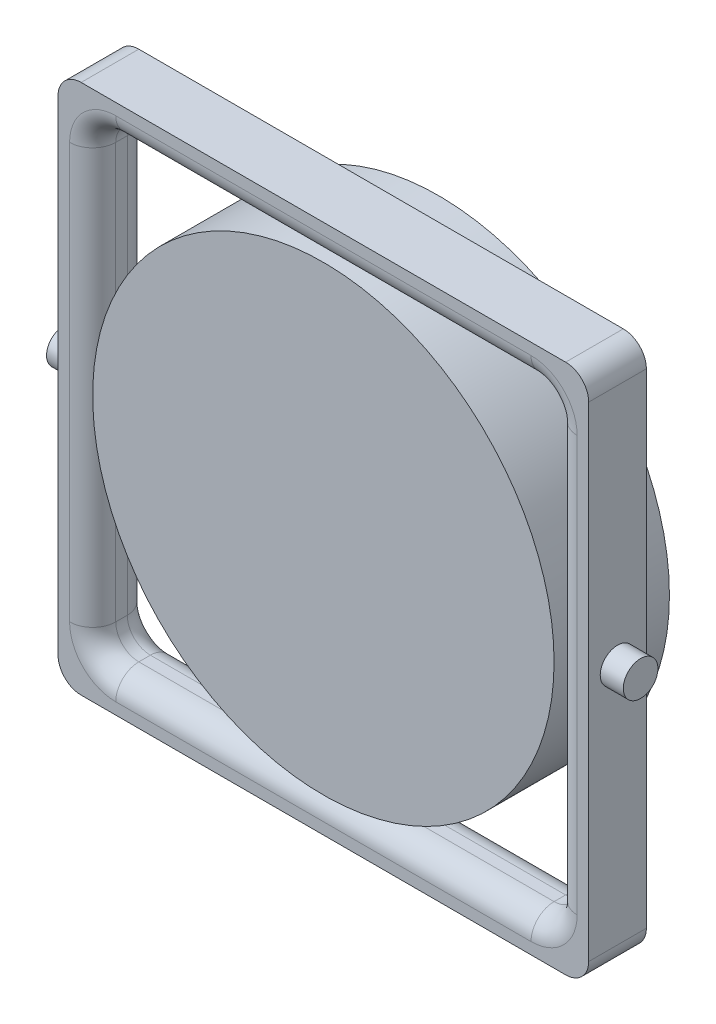
ISO-10303-21;
HEADER;
FILE_DESCRIPTION(('STEP AP214'),'2;1');
FILE_NAME('part.step','',(''),(''),'','','');
FILE_SCHEMA(('AUTOMOTIVE_DESIGN { 1 0 10303 214 1 1 1 1 }'));
ENDSEC;
DATA;
#1=APPLICATION_CONTEXT('core data for automotive mechanical design processes');
#2=APPLICATION_PROTOCOL_DEFINITION('international standard','automotive_design',2000,#1);
#3=PRODUCT_CONTEXT('',#1,'mechanical');
#4=PRODUCT('Part','Part','',(#3));
#5=PRODUCT_RELATED_PRODUCT_CATEGORY('part','',(#4));
#6=PRODUCT_DEFINITION_FORMATION('','',#4);
#7=PRODUCT_DEFINITION_CONTEXT('part definition',#1,'design');
#8=PRODUCT_DEFINITION('design','',#6,#7);
#9=PRODUCT_DEFINITION_SHAPE('','',#8);
#10=(LENGTH_UNIT() NAMED_UNIT(*) SI_UNIT(.MILLI.,.METRE.));
#11=(NAMED_UNIT(*) PLANE_ANGLE_UNIT() SI_UNIT($,.RADIAN.));
#12=(NAMED_UNIT(*) SI_UNIT($,.STERADIAN.) SOLID_ANGLE_UNIT());
#13=UNCERTAINTY_MEASURE_WITH_UNIT(LENGTH_MEASURE(1.E-05),#10,'distance_accuracy_value','');
#14=(GEOMETRIC_REPRESENTATION_CONTEXT(3) GLOBAL_UNCERTAINTY_ASSIGNED_CONTEXT((#13)) GLOBAL_UNIT_ASSIGNED_CONTEXT((#10,
#11,#12)) REPRESENTATION_CONTEXT('',''));
#15=CARTESIAN_POINT('',(0.,0.,0.));
#16=DIRECTION('',(0.,0.,1.));
#17=DIRECTION('',(1.,0.,0.));
#18=AXIS2_PLACEMENT_3D('',#15,#16,#17);
#19=CARTESIAN_POINT('',(0.,0.,-5.));
#20=DIRECTION('',(0.,0.,1.));
#21=DIRECTION('',(1.,0.,0.));
#22=AXIS2_PLACEMENT_3D('',#19,#20,#21);
#23=CYLINDRICAL_SURFACE('',#22,20.);
#24=CARTESIAN_POINT('',(0.,0.,-5.));
#25=DIRECTION('',(0.,0.,1.));
#26=DIRECTION('',(1.,0.,0.));
#27=AXIS2_PLACEMENT_3D('',#24,#25,#26);
#28=CIRCLE('',#27,20.);
#29=CARTESIAN_POINT('',(20.,0.,-5.));
#30=VERTEX_POINT('',#29);
#31=EDGE_CURVE('E11',#30,#30,#28,.T.);
#32=ORIENTED_EDGE('',*,*,#31,.T.);
#33=EDGE_LOOP('',(#32));
#34=FACE_BOUND('',#33,.T.);
#35=CARTESIAN_POINT('',(0.,0.,5.));
#36=DIRECTION('',(0.,0.,1.));
#37=DIRECTION('',(1.,0.,0.));
#38=AXIS2_PLACEMENT_3D('',#35,#36,#37);
#39=CIRCLE('',#38,20.);
#40=CARTESIAN_POINT('',(20.,0.,5.));
#41=VERTEX_POINT('',#40);
#42=EDGE_CURVE('E48',#41,#41,#39,.T.);
#43=ORIENTED_EDGE('',*,*,#42,.F.);
#44=EDGE_LOOP('',(#43));
#45=FACE_BOUND('',#44,.T.);
#46=ADVANCED_FACE('F45',(#34,#45),#23,.T.);
#47=CARTESIAN_POINT('',(0.,0.,-5.));
#48=DIRECTION('',(0.,0.,1.));
#49=DIRECTION('',(1.,0.,0.));
#50=AXIS2_PLACEMENT_3D('',#47,#48,#49);
#51=PLANE('',#50);
#52=ORIENTED_EDGE('',*,*,#31,.F.);
#53=EDGE_LOOP('',(#52));
#54=FACE_BOUND('',#53,.T.);
#55=ADVANCED_FACE('F60',(#54),#51,.F.);
#56=CARTESIAN_POINT('',(0.,0.,5.));
#57=DIRECTION('',(0.,0.,1.));
#58=DIRECTION('',(1.,0.,0.));
#59=AXIS2_PLACEMENT_3D('',#56,#57,#58);
#60=PLANE('',#59);
#61=ORIENTED_EDGE('',*,*,#42,.T.);
#62=EDGE_LOOP('',(#61));
#63=FACE_BOUND('',#62,.T.);
#64=ADVANCED_FACE('F57',(#63),#60,.T.);
#65=CLOSED_SHELL('',(#46,#55,#64));
#66=MANIFOLD_SOLID_BREP('B2',#65);
#67=CARTESIAN_POINT('',(23.,-23.,5.));
#68=DIRECTION('',(-1.,0.,0.));
#69=DIRECTION('',(0.,0.,1.));
#70=AXIS2_PLACEMENT_3D('',#67,#68,#69);
#71=PLANE('',#70);
#72=CARTESIAN_POINT('',(23.,0.,2.5));
#73=DIRECTION('',(-1.,0.,0.));
#74=DIRECTION('',(0.,0.,1.));
#75=AXIS2_PLACEMENT_3D('',#72,#73,#74);
#76=CIRCLE('',#75,1.5);
#77=CARTESIAN_POINT('',(23.,0.,4.));
#78=VERTEX_POINT('',#77);
#79=EDGE_CURVE('E43',#78,#78,#76,.F.);
#80=ORIENTED_EDGE('',*,*,#79,.F.);
#81=EDGE_LOOP('',(#80));
#82=FACE_BOUND('',#81,.T.);
#83=DIRECTION('',(0.,1.,0.));
#84=VECTOR('',#83,1.);
#85=CARTESIAN_POINT('',(23.,-23.,5.));
#86=LINE('',#85,#84);
#87=CARTESIAN_POINT('',(23.,-21.,5.));
#88=VERTEX_POINT('',#87);
#89=CARTESIAN_POINT('',(23.,21.,5.));
#90=VERTEX_POINT('',#89);
#91=EDGE_CURVE('E897',#88,#90,#86,.T.);
#92=ORIENTED_EDGE('',*,*,#91,.F.);
#93=DIRECTION('',(0.,0.,-1.));
#94=VECTOR('',#93,1.);
#95=CARTESIAN_POINT('',(23.,-21.,5.));
#96=LINE('',#95,#94);
#97=CARTESIAN_POINT('',(23.,-21.,0.));
#98=VERTEX_POINT('',#97);
#99=EDGE_CURVE('E271',#88,#98,#96,.T.);
#100=ORIENTED_EDGE('',*,*,#99,.T.);
#101=DIRECTION('',(0.,1.,0.));
#102=VECTOR('',#101,1.);
#103=CARTESIAN_POINT('',(23.,-23.,0.));
#104=LINE('',#103,#102);
#105=CARTESIAN_POINT('',(23.,21.,0.));
#106=VERTEX_POINT('',#105);
#107=EDGE_CURVE('E375',#98,#106,#104,.T.);
#108=ORIENTED_EDGE('',*,*,#107,.T.);
#109=DIRECTION('',(0.,0.,-1.));
#110=VECTOR('',#109,1.);
#111=CARTESIAN_POINT('',(23.,21.,5.));
#112=LINE('',#111,#110);
#113=EDGE_CURVE('E353',#106,#90,#112,.F.);
#114=ORIENTED_EDGE('',*,*,#113,.T.);
#115=EDGE_LOOP('',(#92,#100,#108,#114));
#116=FACE_BOUND('',#115,.T.);
#117=ADVANCED_FACE('F86',(#82,#116),#71,.F.);
#118=CARTESIAN_POINT('',(-23.,23.,5.));
#119=DIRECTION('',(0.,-1.,0.));
#120=DIRECTION('',(0.,0.,-1.));
#121=AXIS2_PLACEMENT_3D('',#118,#119,#120);
#122=PLANE('',#121);
#123=DIRECTION('',(-1.,0.,0.));
#124=VECTOR('',#123,1.);
#125=CARTESIAN_POINT('',(-23.,23.,0.));
#126=LINE('',#125,#124);
#127=CARTESIAN_POINT('',(21.,23.,0.));
#128=VERTEX_POINT('',#127);
#129=CARTESIAN_POINT('',(-21.,23.,0.));
#130=VERTEX_POINT('',#129);
#131=EDGE_CURVE('E885',#128,#130,#126,.T.);
#132=ORIENTED_EDGE('',*,*,#131,.T.);
#133=DIRECTION('',(0.,0.,-1.));
#134=VECTOR('',#133,1.);
#135=CARTESIAN_POINT('',(-21.,23.,5.));
#136=LINE('',#135,#134);
#137=CARTESIAN_POINT('',(-21.,23.,5.));
#138=VERTEX_POINT('',#137);
#139=EDGE_CURVE('E338',#130,#138,#136,.F.);
#140=ORIENTED_EDGE('',*,*,#139,.T.);
#141=DIRECTION('',(-1.,0.,0.));
#142=VECTOR('',#141,1.);
#143=CARTESIAN_POINT('',(-23.,23.,5.));
#144=LINE('',#143,#142);
#145=CARTESIAN_POINT('',(21.,23.,5.));
#146=VERTEX_POINT('',#145);
#147=EDGE_CURVE('E879',#146,#138,#144,.T.);
#148=ORIENTED_EDGE('',*,*,#147,.F.);
#149=DIRECTION('',(0.,0.,-1.));
#150=VECTOR('',#149,1.);
#151=CARTESIAN_POINT('',(21.,23.,5.));
#152=LINE('',#151,#150);
#153=EDGE_CURVE('E335',#146,#128,#152,.T.);
#154=ORIENTED_EDGE('',*,*,#153,.T.);
#155=EDGE_LOOP('',(#132,#140,#148,#154));
#156=FACE_BOUND('',#155,.T.);
#157=ADVANCED_FACE('F524',(#156),#122,.F.);
#158=CARTESIAN_POINT('',(-23.,-23.,5.));
#159=DIRECTION('',(1.,0.,0.));
#160=DIRECTION('',(0.,0.,-1.));
#161=AXIS2_PLACEMENT_3D('',#158,#159,#160);
#162=PLANE('',#161);
#163=CARTESIAN_POINT('',(-23.,0.,2.5));
#164=DIRECTION('',(1.,0.,0.));
#165=DIRECTION('',(0.,0.,-1.));
#166=AXIS2_PLACEMENT_3D('',#163,#164,#165);
#167=CIRCLE('',#166,1.5);
#168=CARTESIAN_POINT('',(-23.,0.,1.));
#169=VERTEX_POINT('',#168);
#170=EDGE_CURVE('E870',#169,#169,#167,.T.);
#171=ORIENTED_EDGE('',*,*,#170,.T.);
#172=EDGE_LOOP('',(#171));
#173=FACE_BOUND('',#172,.T.);
#174=DIRECTION('',(0.,-1.,0.));
#175=VECTOR('',#174,1.);
#176=CARTESIAN_POINT('',(-23.,-23.,5.));
#177=LINE('',#176,#175);
#178=CARTESIAN_POINT('',(-23.,21.,5.));
#179=VERTEX_POINT('',#178);
#180=CARTESIAN_POINT('',(-23.,-21.,5.));
#181=VERTEX_POINT('',#180);
#182=EDGE_CURVE('E873',#179,#181,#177,.T.);
#183=ORIENTED_EDGE('',*,*,#182,.F.);
#184=DIRECTION('',(0.,0.,-1.));
#185=VECTOR('',#184,1.);
#186=CARTESIAN_POINT('',(-23.,21.,5.));
#187=LINE('',#186,#185);
#188=CARTESIAN_POINT('',(-23.,21.,0.));
#189=VERTEX_POINT('',#188);
#190=EDGE_CURVE('E332',#179,#189,#187,.T.);
#191=ORIENTED_EDGE('',*,*,#190,.T.);
#192=DIRECTION('',(0.,-1.,0.));
#193=VECTOR('',#192,1.);
#194=CARTESIAN_POINT('',(-23.,-23.,0.));
#195=LINE('',#194,#193);
#196=CARTESIAN_POINT('',(-23.,-21.,0.));
#197=VERTEX_POINT('',#196);
#198=EDGE_CURVE('E886',#189,#197,#195,.T.);
#199=ORIENTED_EDGE('',*,*,#198,.T.);
#200=DIRECTION('',(0.,0.,-1.));
#201=VECTOR('',#200,1.);
#202=CARTESIAN_POINT('',(-23.,-21.,5.));
#203=LINE('',#202,#201);
#204=EDGE_CURVE('E330',#197,#181,#203,.F.);
#205=ORIENTED_EDGE('',*,*,#204,.T.);
#206=EDGE_LOOP('',(#183,#191,#199,#205));
#207=FACE_BOUND('',#206,.T.);
#208=ADVANCED_FACE('F530',(#173,#207),#162,.F.);
#209=CARTESIAN_POINT('',(-23.,-23.,5.));
#210=DIRECTION('',(0.,1.,0.));
#211=DIRECTION('',(0.,0.,1.));
#212=AXIS2_PLACEMENT_3D('',#209,#210,#211);
#213=PLANE('',#212);
#214=DIRECTION('',(1.,0.,0.));
#215=VECTOR('',#214,1.);
#216=CARTESIAN_POINT('',(-23.,-23.,5.));
#217=LINE('',#216,#215);
#218=CARTESIAN_POINT('',(-21.,-23.,5.));
#219=VERTEX_POINT('',#218);
#220=CARTESIAN_POINT('',(21.,-23.,5.));
#221=VERTEX_POINT('',#220);
#222=EDGE_CURVE('E442',#219,#221,#217,.T.);
#223=ORIENTED_EDGE('',*,*,#222,.F.);
#224=DIRECTION('',(0.,0.,-1.));
#225=VECTOR('',#224,1.);
#226=CARTESIAN_POINT('',(-21.,-23.,5.));
#227=LINE('',#226,#225);
#228=CARTESIAN_POINT('',(-21.,-23.,0.));
#229=VERTEX_POINT('',#228);
#230=EDGE_CURVE('E350',#219,#229,#227,.T.);
#231=ORIENTED_EDGE('',*,*,#230,.T.);
#232=DIRECTION('',(1.,0.,0.));
#233=VECTOR('',#232,1.);
#234=CARTESIAN_POINT('',(-23.,-23.,0.));
#235=LINE('',#234,#233);
#236=CARTESIAN_POINT('',(21.,-23.,0.));
#237=VERTEX_POINT('',#236);
#238=EDGE_CURVE('E891',#229,#237,#235,.T.);
#239=ORIENTED_EDGE('',*,*,#238,.T.);
#240=DIRECTION('',(0.,0.,-1.));
#241=VECTOR('',#240,1.);
#242=CARTESIAN_POINT('',(21.,-23.,5.));
#243=LINE('',#242,#241);
#244=EDGE_CURVE('E348',#237,#221,#243,.F.);
#245=ORIENTED_EDGE('',*,*,#244,.T.);
#246=EDGE_LOOP('',(#223,#231,#239,#245));
#247=FACE_BOUND('',#246,.T.);
#248=ADVANCED_FACE('F815',(#247),#213,.F.);
#249=CARTESIAN_POINT('',(0.,0.,5.));
#250=DIRECTION('',(0.,0.,-1.));
#251=DIRECTION('',(-1.,0.,0.));
#252=AXIS2_PLACEMENT_3D('',#249,#250,#251);
#253=PLANE('',#252);
#254=DIRECTION('',(0.,-1.,0.));
#255=VECTOR('',#254,1.);
#256=CARTESIAN_POINT('',(-22.,0.,5.));
#257=LINE('',#256,#255);
#258=CARTESIAN_POINT('',(-22.,-18.,5.));
#259=VERTEX_POINT('',#258);
#260=CARTESIAN_POINT('',(-22.,18.,5.));
#261=VERTEX_POINT('',#260);
#262=EDGE_CURVE('E270',#259,#261,#257,.F.);
#263=ORIENTED_EDGE('',*,*,#262,.T.);
#264=CARTESIAN_POINT('',(-18.,18.,5.));
#265=DIRECTION('',(0.,0.,-1.));
#266=DIRECTION('',(-1.,0.,0.));
#267=AXIS2_PLACEMENT_3D('',#264,#265,#266);
#268=CIRCLE('',#267,4.);
#269=CARTESIAN_POINT('',(-18.,22.,5.));
#270=VERTEX_POINT('',#269);
#271=EDGE_CURVE('E389',#261,#270,#268,.T.);
#272=ORIENTED_EDGE('',*,*,#271,.T.);
#273=DIRECTION('',(-1.,0.,0.));
#274=VECTOR('',#273,1.);
#275=CARTESIAN_POINT('',(0.,22.,5.));
#276=LINE('',#275,#274);
#277=CARTESIAN_POINT('',(18.,22.,5.));
#278=VERTEX_POINT('',#277);
#279=EDGE_CURVE('E387',#270,#278,#276,.F.);
#280=ORIENTED_EDGE('',*,*,#279,.T.);
#281=CARTESIAN_POINT('',(18.,18.,5.));
#282=DIRECTION('',(0.,0.,-1.));
#283=DIRECTION('',(-1.,0.,0.));
#284=AXIS2_PLACEMENT_3D('',#281,#282,#283);
#285=CIRCLE('',#284,4.);
#286=CARTESIAN_POINT('',(22.,18.,5.));
#287=VERTEX_POINT('',#286);
#288=EDGE_CURVE('E385',#278,#287,#285,.T.);
#289=ORIENTED_EDGE('',*,*,#288,.T.);
#290=DIRECTION('',(0.,1.,0.));
#291=VECTOR('',#290,1.);
#292=CARTESIAN_POINT('',(22.,0.,5.));
#293=LINE('',#292,#291);
#294=CARTESIAN_POINT('',(22.,-18.,5.));
#295=VERTEX_POINT('',#294);
#296=EDGE_CURVE('E383',#287,#295,#293,.F.);
#297=ORIENTED_EDGE('',*,*,#296,.T.);
#298=CARTESIAN_POINT('',(18.,-18.,5.));
#299=DIRECTION('',(0.,0.,-1.));
#300=DIRECTION('',(-1.,0.,0.));
#301=AXIS2_PLACEMENT_3D('',#298,#299,#300);
#302=CIRCLE('',#301,4.);
#303=CARTESIAN_POINT('',(18.,-22.,5.));
#304=VERTEX_POINT('',#303);
#305=EDGE_CURVE('E381',#295,#304,#302,.T.);
#306=ORIENTED_EDGE('',*,*,#305,.T.);
#307=DIRECTION('',(1.,0.,0.));
#308=VECTOR('',#307,1.);
#309=CARTESIAN_POINT('',(0.,-22.,5.));
#310=LINE('',#309,#308);
#311=CARTESIAN_POINT('',(-18.,-22.,5.));
#312=VERTEX_POINT('',#311);
#313=EDGE_CURVE('E379',#304,#312,#310,.F.);
#314=ORIENTED_EDGE('',*,*,#313,.T.);
#315=CARTESIAN_POINT('',(-18.,-18.,5.));
#316=DIRECTION('',(0.,0.,-1.));
#317=DIRECTION('',(-1.,0.,0.));
#318=AXIS2_PLACEMENT_3D('',#315,#316,#317);
#319=CIRCLE('',#318,4.);
#320=EDGE_CURVE('E377',#312,#259,#319,.T.);
#321=ORIENTED_EDGE('',*,*,#320,.T.);
#322=EDGE_LOOP('',(#263,#272,#280,#289,#297,#306,#314,#321));
#323=FACE_BOUND('',#322,.T.);
#324=ORIENTED_EDGE('',*,*,#147,.T.);
#325=CARTESIAN_POINT('',(-21.,21.,5.));
#326=DIRECTION('',(0.,0.,-1.));
#327=DIRECTION('',(-1.,0.,0.));
#328=AXIS2_PLACEMENT_3D('',#325,#326,#327);
#329=CIRCLE('',#328,2.);
#330=EDGE_CURVE('E346',#138,#179,#329,.F.);
#331=ORIENTED_EDGE('',*,*,#330,.T.);
#332=ORIENTED_EDGE('',*,*,#182,.T.);
#333=CARTESIAN_POINT('',(-21.,-21.,5.));
#334=DIRECTION('',(0.,0.,-1.));
#335=DIRECTION('',(-1.,0.,0.));
#336=AXIS2_PLACEMENT_3D('',#333,#334,#335);
#337=CIRCLE('',#336,2.);
#338=EDGE_CURVE('E344',#181,#219,#337,.F.);
#339=ORIENTED_EDGE('',*,*,#338,.T.);
#340=ORIENTED_EDGE('',*,*,#222,.T.);
#341=CARTESIAN_POINT('',(21.,-21.,5.));
#342=DIRECTION('',(0.,0.,-1.));
#343=DIRECTION('',(-1.,0.,0.));
#344=AXIS2_PLACEMENT_3D('',#341,#342,#343);
#345=CIRCLE('',#344,2.);
#346=EDGE_CURVE('E342',#221,#88,#345,.F.);
#347=ORIENTED_EDGE('',*,*,#346,.T.);
#348=ORIENTED_EDGE('',*,*,#91,.T.);
#349=CARTESIAN_POINT('',(21.,21.,5.));
#350=DIRECTION('',(0.,0.,-1.));
#351=DIRECTION('',(-1.,0.,0.));
#352=AXIS2_PLACEMENT_3D('',#349,#350,#351);
#353=CIRCLE('',#352,2.);
#354=EDGE_CURVE('E340',#90,#146,#353,.F.);
#355=ORIENTED_EDGE('',*,*,#354,.T.);
#356=EDGE_LOOP('',(#324,#331,#332,#339,#340,#347,#348,#355));
#357=FACE_BOUND('',#356,.T.);
#358=ADVANCED_FACE('F506',(#323,#357),#253,.F.);
#359=CARTESIAN_POINT('',(0.,0.,0.));
#360=DIRECTION('',(0.,0.,-1.));
#361=DIRECTION('',(-1.,0.,0.));
#362=AXIS2_PLACEMENT_3D('',#359,#360,#361);
#363=PLANE('',#362);
#364=CARTESIAN_POINT('',(-18.,-18.,0.));
#365=DIRECTION('',(0.,0.,-1.));
#366=DIRECTION('',(-1.,0.,0.));
#367=AXIS2_PLACEMENT_3D('',#364,#365,#366);
#368=CIRCLE('',#367,4.);
#369=CARTESIAN_POINT('',(-22.,-18.,0.));
#370=VERTEX_POINT('',#369);
#371=CARTESIAN_POINT('',(-18.,-22.,0.));
#372=VERTEX_POINT('',#371);
#373=EDGE_CURVE('E305',#370,#372,#368,.F.);
#374=ORIENTED_EDGE('',*,*,#373,.T.);
#375=DIRECTION('',(-1.,0.,0.));
#376=VECTOR('',#375,1.);
#377=CARTESIAN_POINT('',(18.,-22.,0.));
#378=LINE('',#377,#376);
#379=CARTESIAN_POINT('',(18.,-22.,0.));
#380=VERTEX_POINT('',#379);
#381=EDGE_CURVE('E307',#372,#380,#378,.F.);
#382=ORIENTED_EDGE('',*,*,#381,.T.);
#383=CARTESIAN_POINT('',(18.,-18.,0.));
#384=DIRECTION('',(0.,0.,-1.));
#385=DIRECTION('',(-1.,0.,0.));
#386=AXIS2_PLACEMENT_3D('',#383,#384,#385);
#387=CIRCLE('',#386,4.);
#388=CARTESIAN_POINT('',(22.,-18.,0.));
#389=VERTEX_POINT('',#388);
#390=EDGE_CURVE('E276',#380,#389,#387,.F.);
#391=ORIENTED_EDGE('',*,*,#390,.T.);
#392=DIRECTION('',(0.,-1.,0.));
#393=VECTOR('',#392,1.);
#394=CARTESIAN_POINT('',(22.,18.,0.));
#395=LINE('',#394,#393);
#396=CARTESIAN_POINT('',(22.,18.,0.));
#397=VERTEX_POINT('',#396);
#398=EDGE_CURVE('E295',#389,#397,#395,.F.);
#399=ORIENTED_EDGE('',*,*,#398,.T.);
#400=CARTESIAN_POINT('',(18.,18.,0.));
#401=DIRECTION('',(0.,0.,-1.));
#402=DIRECTION('',(-1.,0.,0.));
#403=AXIS2_PLACEMENT_3D('',#400,#401,#402);
#404=CIRCLE('',#403,4.);
#405=CARTESIAN_POINT('',(18.,22.,0.));
#406=VERTEX_POINT('',#405);
#407=EDGE_CURVE('E297',#397,#406,#404,.F.);
#408=ORIENTED_EDGE('',*,*,#407,.T.);
#409=DIRECTION('',(1.,0.,0.));
#410=VECTOR('',#409,1.);
#411=CARTESIAN_POINT('',(-18.,22.,0.));
#412=LINE('',#411,#410);
#413=CARTESIAN_POINT('',(-18.,22.,0.));
#414=VERTEX_POINT('',#413);
#415=EDGE_CURVE('E299',#406,#414,#412,.F.);
#416=ORIENTED_EDGE('',*,*,#415,.T.);
#417=CARTESIAN_POINT('',(-18.,18.,0.));
#418=DIRECTION('',(0.,0.,-1.));
#419=DIRECTION('',(-1.,0.,0.));
#420=AXIS2_PLACEMENT_3D('',#417,#418,#419);
#421=CIRCLE('',#420,4.);
#422=CARTESIAN_POINT('',(-22.,18.,0.));
#423=VERTEX_POINT('',#422);
#424=EDGE_CURVE('E301',#414,#423,#421,.F.);
#425=ORIENTED_EDGE('',*,*,#424,.T.);
#426=DIRECTION('',(0.,1.,0.));
#427=VECTOR('',#426,1.);
#428=CARTESIAN_POINT('',(-22.,-18.,0.));
#429=LINE('',#428,#427);
#430=EDGE_CURVE('E303',#423,#370,#429,.F.);
#431=ORIENTED_EDGE('',*,*,#430,.T.);
#432=EDGE_LOOP('',(#374,#382,#391,#399,#408,#416,#425,#431));
#433=FACE_BOUND('',#432,.T.);
#434=ORIENTED_EDGE('',*,*,#198,.F.);
#435=CARTESIAN_POINT('',(-21.,21.,0.));
#436=DIRECTION('',(0.,0.,-1.));
#437=DIRECTION('',(-1.,0.,0.));
#438=AXIS2_PLACEMENT_3D('',#435,#436,#437);
#439=CIRCLE('',#438,2.);
#440=EDGE_CURVE('E313',#189,#130,#439,.T.);
#441=ORIENTED_EDGE('',*,*,#440,.T.);
#442=ORIENTED_EDGE('',*,*,#131,.F.);
#443=CARTESIAN_POINT('',(21.,21.,0.));
#444=DIRECTION('',(0.,0.,-1.));
#445=DIRECTION('',(-1.,0.,0.));
#446=AXIS2_PLACEMENT_3D('',#443,#444,#445);
#447=CIRCLE('',#446,2.);
#448=EDGE_CURVE('E286',#128,#106,#447,.T.);
#449=ORIENTED_EDGE('',*,*,#448,.T.);
#450=ORIENTED_EDGE('',*,*,#107,.F.);
#451=CARTESIAN_POINT('',(21.,-21.,0.));
#452=DIRECTION('',(0.,0.,-1.));
#453=DIRECTION('',(-1.,0.,0.));
#454=AXIS2_PLACEMENT_3D('',#451,#452,#453);
#455=CIRCLE('',#454,2.);
#456=EDGE_CURVE('E309',#98,#237,#455,.T.);
#457=ORIENTED_EDGE('',*,*,#456,.T.);
#458=ORIENTED_EDGE('',*,*,#238,.F.);
#459=CARTESIAN_POINT('',(-21.,-21.,0.));
#460=DIRECTION('',(0.,0.,-1.));
#461=DIRECTION('',(-1.,0.,0.));
#462=AXIS2_PLACEMENT_3D('',#459,#460,#461);
#463=CIRCLE('',#462,2.);
#464=EDGE_CURVE('E311',#229,#197,#463,.T.);
#465=ORIENTED_EDGE('',*,*,#464,.T.);
#466=EDGE_LOOP('',(#434,#441,#442,#449,#450,#457,#458,#465));
#467=FACE_BOUND('',#466,.T.);
#468=ADVANCED_FACE('F486',(#433,#467),#363,.T.);
#469=CARTESIAN_POINT('',(20.,-20.,-10.));
#470=DIRECTION('',(1.,0.,0.));
#471=DIRECTION('',(0.,0.,-1.));
#472=AXIS2_PLACEMENT_3D('',#469,#470,#471);
#473=PLANE('',#472);
#474=DIRECTION('',(0.,0.,1.));
#475=VECTOR('',#474,1.);
#476=CARTESIAN_POINT('',(20.,-18.,5.));
#477=LINE('',#476,#475);
#478=CARTESIAN_POINT('',(20.,-18.,2.));
#479=VERTEX_POINT('',#478);
#480=CARTESIAN_POINT('',(20.,-18.,3.));
#481=VERTEX_POINT('',#480);
#482=EDGE_CURVE('E266',#479,#481,#477,.T.);
#483=ORIENTED_EDGE('',*,*,#482,.T.);
#484=DIRECTION('',(0.,1.,0.));
#485=VECTOR('',#484,1.);
#486=CARTESIAN_POINT('',(20.,-20.,3.));
#487=LINE('',#486,#485);
#488=CARTESIAN_POINT('',(20.,18.,3.));
#489=VERTEX_POINT('',#488);
#490=EDGE_CURVE('E399',#481,#489,#487,.T.);
#491=ORIENTED_EDGE('',*,*,#490,.T.);
#492=DIRECTION('',(0.,0.,1.));
#493=VECTOR('',#492,1.);
#494=CARTESIAN_POINT('',(20.,18.,0.));
#495=LINE('',#494,#493);
#496=CARTESIAN_POINT('',(20.,18.,2.));
#497=VERTEX_POINT('',#496);
#498=EDGE_CURVE('E439',#489,#497,#495,.F.);
#499=ORIENTED_EDGE('',*,*,#498,.T.);
#500=DIRECTION('',(0.,-1.,0.));
#501=VECTOR('',#500,1.);
#502=CARTESIAN_POINT('',(20.,-18.,2.));
#503=LINE('',#502,#501);
#504=EDGE_CURVE('E328',#497,#479,#503,.T.);
#505=ORIENTED_EDGE('',*,*,#504,.T.);
#506=EDGE_LOOP('',(#483,#491,#499,#505));
#507=FACE_BOUND('',#506,.T.);
#508=ADVANCED_FACE('F436',(#507),#473,.F.);
#509=CARTESIAN_POINT('',(-20.,-20.,-10.));
#510=DIRECTION('',(0.,-1.,0.));
#511=DIRECTION('',(0.,0.,-1.));
#512=AXIS2_PLACEMENT_3D('',#509,#510,#511);
#513=PLANE('',#512);
#514=DIRECTION('',(0.,0.,1.));
#515=VECTOR('',#514,1.);
#516=CARTESIAN_POINT('',(-18.,-20.,5.));
#517=LINE('',#516,#515);
#518=CARTESIAN_POINT('',(-18.,-20.,2.));
#519=VERTEX_POINT('',#518);
#520=CARTESIAN_POINT('',(-18.,-20.,3.));
#521=VERTEX_POINT('',#520);
#522=EDGE_CURVE('E258',#519,#521,#517,.T.);
#523=ORIENTED_EDGE('',*,*,#522,.T.);
#524=DIRECTION('',(1.,0.,0.));
#525=VECTOR('',#524,1.);
#526=CARTESIAN_POINT('',(-20.,-20.,3.));
#527=LINE('',#526,#525);
#528=CARTESIAN_POINT('',(18.,-20.,3.));
#529=VERTEX_POINT('',#528);
#530=EDGE_CURVE('E254',#521,#529,#527,.T.);
#531=ORIENTED_EDGE('',*,*,#530,.T.);
#532=DIRECTION('',(0.,0.,1.));
#533=VECTOR('',#532,1.);
#534=CARTESIAN_POINT('',(18.,-20.,0.));
#535=LINE('',#534,#533);
#536=CARTESIAN_POINT('',(18.,-20.,2.));
#537=VERTEX_POINT('',#536);
#538=EDGE_CURVE('E248',#529,#537,#535,.F.);
#539=ORIENTED_EDGE('',*,*,#538,.T.);
#540=DIRECTION('',(-1.,0.,0.));
#541=VECTOR('',#540,1.);
#542=CARTESIAN_POINT('',(-18.,-20.,2.));
#543=LINE('',#542,#541);
#544=EDGE_CURVE('E252',#537,#519,#543,.T.);
#545=ORIENTED_EDGE('',*,*,#544,.T.);
#546=EDGE_LOOP('',(#523,#531,#539,#545));
#547=FACE_BOUND('',#546,.T.);
#548=ADVANCED_FACE('F250',(#547),#513,.F.);
#549=CARTESIAN_POINT('',(-20.,-20.,-10.));
#550=DIRECTION('',(-1.,0.,0.));
#551=DIRECTION('',(0.,0.,1.));
#552=AXIS2_PLACEMENT_3D('',#549,#550,#551);
#553=PLANE('',#552);
#554=DIRECTION('',(0.,0.,1.));
#555=VECTOR('',#554,1.);
#556=CARTESIAN_POINT('',(-20.,18.,5.));
#557=LINE('',#556,#555);
#558=CARTESIAN_POINT('',(-20.,18.,2.));
#559=VERTEX_POINT('',#558);
#560=CARTESIAN_POINT('',(-20.,18.,3.));
#561=VERTEX_POINT('',#560);
#562=EDGE_CURVE('E257',#559,#561,#557,.T.);
#563=ORIENTED_EDGE('',*,*,#562,.T.);
#564=DIRECTION('',(0.,-1.,0.));
#565=VECTOR('',#564,1.);
#566=CARTESIAN_POINT('',(-20.,-20.,3.));
#567=LINE('',#566,#565);
#568=CARTESIAN_POINT('',(-20.,-18.,3.));
#569=VERTEX_POINT('',#568);
#570=EDGE_CURVE('E94',#561,#569,#567,.T.);
#571=ORIENTED_EDGE('',*,*,#570,.T.);
#572=DIRECTION('',(0.,0.,1.));
#573=VECTOR('',#572,1.);
#574=CARTESIAN_POINT('',(-20.,-18.,0.));
#575=LINE('',#574,#573);
#576=CARTESIAN_POINT('',(-20.,-18.,2.));
#577=VERTEX_POINT('',#576);
#578=EDGE_CURVE('E447',#569,#577,#575,.F.);
#579=ORIENTED_EDGE('',*,*,#578,.T.);
#580=DIRECTION('',(0.,1.,0.));
#581=VECTOR('',#580,1.);
#582=CARTESIAN_POINT('',(-20.,18.,2.));
#583=LINE('',#582,#581);
#584=EDGE_CURVE('E318',#577,#559,#583,.T.);
#585=ORIENTED_EDGE('',*,*,#584,.T.);
#586=EDGE_LOOP('',(#563,#571,#579,#585));
#587=FACE_BOUND('',#586,.T.);
#588=ADVANCED_FACE('F475',(#587),#553,.F.);
#589=CARTESIAN_POINT('',(-20.,20.,-10.));
#590=DIRECTION('',(0.,1.,0.));
#591=DIRECTION('',(0.,0.,1.));
#592=AXIS2_PLACEMENT_3D('',#589,#590,#591);
#593=PLANE('',#592);
#594=DIRECTION('',(0.,0.,1.));
#595=VECTOR('',#594,1.);
#596=CARTESIAN_POINT('',(18.,20.,5.));
#597=LINE('',#596,#595);
#598=CARTESIAN_POINT('',(18.,20.,2.));
#599=VERTEX_POINT('',#598);
#600=CARTESIAN_POINT('',(18.,20.,3.));
#601=VERTEX_POINT('',#600);
#602=EDGE_CURVE('E290',#599,#601,#597,.T.);
#603=ORIENTED_EDGE('',*,*,#602,.T.);
#604=DIRECTION('',(-1.,0.,0.));
#605=VECTOR('',#604,1.);
#606=CARTESIAN_POINT('',(-20.,20.,3.));
#607=LINE('',#606,#605);
#608=CARTESIAN_POINT('',(-18.,20.,3.));
#609=VERTEX_POINT('',#608);
#610=EDGE_CURVE('E395',#601,#609,#607,.T.);
#611=ORIENTED_EDGE('',*,*,#610,.T.);
#612=DIRECTION('',(0.,0.,1.));
#613=VECTOR('',#612,1.);
#614=CARTESIAN_POINT('',(-18.,20.,0.));
#615=LINE('',#614,#613);
#616=CARTESIAN_POINT('',(-18.,20.,2.));
#617=VERTEX_POINT('',#616);
#618=EDGE_CURVE('E287',#609,#617,#615,.F.);
#619=ORIENTED_EDGE('',*,*,#618,.T.);
#620=DIRECTION('',(1.,0.,0.));
#621=VECTOR('',#620,1.);
#622=CARTESIAN_POINT('',(18.,20.,2.));
#623=LINE('',#622,#621);
#624=EDGE_CURVE('E323',#617,#599,#623,.T.);
#625=ORIENTED_EDGE('',*,*,#624,.T.);
#626=EDGE_LOOP('',(#603,#611,#619,#625));
#627=FACE_BOUND('',#626,.T.);
#628=ADVANCED_FACE('F452',(#627),#593,.F.);
#629=CARTESIAN_POINT('',(18.,-18.,-10.));
#630=DIRECTION('',(0.,0.,-1.));
#631=DIRECTION('',(-1.,0.,0.));
#632=AXIS2_PLACEMENT_3D('',#629,#630,#631);
#633=CYLINDRICAL_SURFACE('',#632,2.);
#634=ORIENTED_EDGE('',*,*,#538,.F.);
#635=CARTESIAN_POINT('',(18.,-18.,3.));
#636=DIRECTION('',(0.,0.,-1.));
#637=DIRECTION('',(-1.,0.,0.));
#638=AXIS2_PLACEMENT_3D('',#635,#636,#637);
#639=CIRCLE('',#638,2.);
#640=EDGE_CURVE('E401',#529,#481,#639,.F.);
#641=ORIENTED_EDGE('',*,*,#640,.T.);
#642=ORIENTED_EDGE('',*,*,#482,.F.);
#643=CARTESIAN_POINT('',(18.,-18.,2.));
#644=DIRECTION('',(0.,0.,-1.));
#645=DIRECTION('',(-1.,0.,0.));
#646=AXIS2_PLACEMENT_3D('',#643,#644,#645);
#647=CIRCLE('',#646,2.);
#648=EDGE_CURVE('E262',#479,#537,#647,.T.);
#649=ORIENTED_EDGE('',*,*,#648,.T.);
#650=EDGE_LOOP('',(#634,#641,#642,#649));
#651=FACE_BOUND('',#650,.T.);
#652=ADVANCED_FACE('F264',(#651),#633,.F.);
#653=CARTESIAN_POINT('',(-18.,-18.,-10.));
#654=DIRECTION('',(0.,0.,-1.));
#655=DIRECTION('',(-1.,0.,0.));
#656=AXIS2_PLACEMENT_3D('',#653,#654,#655);
#657=CYLINDRICAL_SURFACE('',#656,2.);
#658=ORIENTED_EDGE('',*,*,#578,.F.);
#659=CARTESIAN_POINT('',(-18.,-18.,3.));
#660=DIRECTION('',(0.,0.,-1.));
#661=DIRECTION('',(-1.,0.,0.));
#662=AXIS2_PLACEMENT_3D('',#659,#660,#661);
#663=CIRCLE('',#662,2.);
#664=EDGE_CURVE('E107',#569,#521,#663,.F.);
#665=ORIENTED_EDGE('',*,*,#664,.T.);
#666=ORIENTED_EDGE('',*,*,#522,.F.);
#667=CARTESIAN_POINT('',(-18.,-18.,2.));
#668=DIRECTION('',(0.,0.,-1.));
#669=DIRECTION('',(-1.,0.,0.));
#670=AXIS2_PLACEMENT_3D('',#667,#668,#669);
#671=CIRCLE('',#670,2.);
#672=EDGE_CURVE('E315',#519,#577,#671,.T.);
#673=ORIENTED_EDGE('',*,*,#672,.T.);
#674=EDGE_LOOP('',(#658,#665,#666,#673));
#675=FACE_BOUND('',#674,.T.);
#676=ADVANCED_FACE('F539',(#675),#657,.F.);
#677=CARTESIAN_POINT('',(-18.,18.,-10.));
#678=DIRECTION('',(0.,0.,-1.));
#679=DIRECTION('',(-1.,0.,0.));
#680=AXIS2_PLACEMENT_3D('',#677,#678,#679);
#681=CYLINDRICAL_SURFACE('',#680,2.);
#682=ORIENTED_EDGE('',*,*,#618,.F.);
#683=CARTESIAN_POINT('',(-18.,18.,3.));
#684=DIRECTION('',(0.,0.,-1.));
#685=DIRECTION('',(-1.,0.,0.));
#686=AXIS2_PLACEMENT_3D('',#683,#684,#685);
#687=CIRCLE('',#686,2.);
#688=EDGE_CURVE('E392',#609,#561,#687,.F.);
#689=ORIENTED_EDGE('',*,*,#688,.T.);
#690=ORIENTED_EDGE('',*,*,#562,.F.);
#691=CARTESIAN_POINT('',(-18.,18.,2.));
#692=DIRECTION('',(0.,0.,-1.));
#693=DIRECTION('',(-1.,0.,0.));
#694=AXIS2_PLACEMENT_3D('',#691,#692,#693);
#695=CIRCLE('',#694,2.);
#696=EDGE_CURVE('E320',#559,#617,#695,.T.);
#697=ORIENTED_EDGE('',*,*,#696,.T.);
#698=EDGE_LOOP('',(#682,#689,#690,#697));
#699=FACE_BOUND('',#698,.T.);
#700=ADVANCED_FACE('F473',(#699),#681,.F.);
#701=CARTESIAN_POINT('',(18.,18.,-10.));
#702=DIRECTION('',(0.,0.,-1.));
#703=DIRECTION('',(-1.,0.,0.));
#704=AXIS2_PLACEMENT_3D('',#701,#702,#703);
#705=CYLINDRICAL_SURFACE('',#704,2.);
#706=ORIENTED_EDGE('',*,*,#498,.F.);
#707=CARTESIAN_POINT('',(18.,18.,3.));
#708=DIRECTION('',(0.,0.,-1.));
#709=DIRECTION('',(-1.,0.,0.));
#710=AXIS2_PLACEMENT_3D('',#707,#708,#709);
#711=CIRCLE('',#710,2.);
#712=EDGE_CURVE('E397',#489,#601,#711,.F.);
#713=ORIENTED_EDGE('',*,*,#712,.T.);
#714=ORIENTED_EDGE('',*,*,#602,.F.);
#715=CARTESIAN_POINT('',(18.,18.,2.));
#716=DIRECTION('',(0.,0.,-1.));
#717=DIRECTION('',(-1.,0.,0.));
#718=AXIS2_PLACEMENT_3D('',#715,#716,#717);
#719=CIRCLE('',#718,2.);
#720=EDGE_CURVE('E325',#599,#497,#719,.T.);
#721=ORIENTED_EDGE('',*,*,#720,.T.);
#722=EDGE_LOOP('',(#706,#713,#714,#721));
#723=FACE_BOUND('',#722,.T.);
#724=ADVANCED_FACE('F500',(#723),#705,.F.);
#725=CARTESIAN_POINT('',(-20.,22.,2.));
#726=DIRECTION('',(-1.,0.,0.));
#727=DIRECTION('',(0.,0.,1.));
#728=AXIS2_PLACEMENT_3D('',#725,#726,#727);
#729=CYLINDRICAL_SURFACE('',#728,2.);
#730=CARTESIAN_POINT('',(-18.,22.,2.));
#731=DIRECTION('',(-1.,0.,0.));
#732=DIRECTION('',(0.,0.,1.));
#733=AXIS2_PLACEMENT_3D('',#730,#731,#732);
#734=CIRCLE('',#733,2.);
#735=EDGE_CURVE('E369',#414,#617,#734,.T.);
#736=ORIENTED_EDGE('',*,*,#735,.F.);
#737=ORIENTED_EDGE('',*,*,#415,.F.);
#738=CARTESIAN_POINT('',(18.,22.,2.));
#739=DIRECTION('',(1.,0.,0.));
#740=DIRECTION('',(0.,0.,-1.));
#741=AXIS2_PLACEMENT_3D('',#738,#739,#740);
#742=CIRCLE('',#741,2.);
#743=EDGE_CURVE('E372',#599,#406,#742,.T.);
#744=ORIENTED_EDGE('',*,*,#743,.F.);
#745=ORIENTED_EDGE('',*,*,#624,.F.);
#746=EDGE_LOOP('',(#736,#737,#744,#745));
#747=FACE_BOUND('',#746,.T.);
#748=ADVANCED_FACE('F494',(#747),#729,.T.);
#749=CARTESIAN_POINT('',(18.,18.,2.));
#750=DIRECTION('',(0.,0.,-1.));
#751=DIRECTION('',(-1.,0.,0.));
#752=AXIS2_PLACEMENT_3D('',#749,#750,#751);
#753=TOROIDAL_SURFACE('',#752,4.,2.);
#754=ORIENTED_EDGE('',*,*,#743,.T.);
#755=ORIENTED_EDGE('',*,*,#407,.F.);
#756=CARTESIAN_POINT('',(22.,18.,2.));
#757=DIRECTION('',(0.,-1.,0.));
#758=DIRECTION('',(0.,0.,-1.));
#759=AXIS2_PLACEMENT_3D('',#756,#757,#758);
#760=CIRCLE('',#759,2.);
#761=EDGE_CURVE('E366',#497,#397,#760,.T.);
#762=ORIENTED_EDGE('',*,*,#761,.F.);
#763=ORIENTED_EDGE('',*,*,#720,.F.);
#764=EDGE_LOOP('',(#754,#755,#762,#763));
#765=FACE_BOUND('',#764,.T.);
#766=ADVANCED_FACE('F499',(#765),#753,.T.);
#767=CARTESIAN_POINT('',(-18.,18.,2.));
#768=DIRECTION('',(0.,0.,-1.));
#769=DIRECTION('',(-1.,0.,0.));
#770=AXIS2_PLACEMENT_3D('',#767,#768,#769);
#771=TOROIDAL_SURFACE('',#770,4.,2.);
#772=ORIENTED_EDGE('',*,*,#735,.T.);
#773=ORIENTED_EDGE('',*,*,#696,.F.);
#774=CARTESIAN_POINT('',(-22.,18.,2.));
#775=DIRECTION('',(0.,-1.,0.));
#776=DIRECTION('',(0.,0.,-1.));
#777=AXIS2_PLACEMENT_3D('',#774,#775,#776);
#778=CIRCLE('',#777,2.);
#779=EDGE_CURVE('E363',#423,#559,#778,.T.);
#780=ORIENTED_EDGE('',*,*,#779,.F.);
#781=ORIENTED_EDGE('',*,*,#424,.F.);
#782=EDGE_LOOP('',(#772,#773,#780,#781));
#783=FACE_BOUND('',#782,.T.);
#784=ADVANCED_FACE('F492',(#783),#771,.T.);
#785=CARTESIAN_POINT('',(22.,-20.,2.));
#786=DIRECTION('',(0.,1.,0.));
#787=DIRECTION('',(0.,0.,1.));
#788=AXIS2_PLACEMENT_3D('',#785,#786,#787);
#789=CYLINDRICAL_SURFACE('',#788,2.);
#790=ORIENTED_EDGE('',*,*,#761,.T.);
#791=ORIENTED_EDGE('',*,*,#398,.F.);
#792=CARTESIAN_POINT('',(22.,-18.,2.));
#793=DIRECTION('',(0.,-1.,0.));
#794=DIRECTION('',(0.,0.,-1.));
#795=AXIS2_PLACEMENT_3D('',#792,#793,#794);
#796=CIRCLE('',#795,2.);
#797=EDGE_CURVE('E361',#479,#389,#796,.T.);
#798=ORIENTED_EDGE('',*,*,#797,.F.);
#799=ORIENTED_EDGE('',*,*,#504,.F.);
#800=EDGE_LOOP('',(#790,#791,#798,#799));
#801=FACE_BOUND('',#800,.T.);
#802=ADVANCED_FACE('F555',(#801),#789,.T.);
#803=CARTESIAN_POINT('',(-22.,-20.,2.));
#804=DIRECTION('',(0.,-1.,0.));
#805=DIRECTION('',(0.,0.,-1.));
#806=AXIS2_PLACEMENT_3D('',#803,#804,#805);
#807=CYLINDRICAL_SURFACE('',#806,2.);
#808=ORIENTED_EDGE('',*,*,#779,.T.);
#809=ORIENTED_EDGE('',*,*,#584,.F.);
#810=CARTESIAN_POINT('',(-22.,-18.,2.));
#811=DIRECTION('',(0.,-1.,0.));
#812=DIRECTION('',(0.,0.,-1.));
#813=AXIS2_PLACEMENT_3D('',#810,#811,#812);
#814=CIRCLE('',#813,2.);
#815=EDGE_CURVE('E280',#370,#577,#814,.T.);
#816=ORIENTED_EDGE('',*,*,#815,.F.);
#817=ORIENTED_EDGE('',*,*,#430,.F.);
#818=EDGE_LOOP('',(#808,#809,#816,#817));
#819=FACE_BOUND('',#818,.T.);
#820=ADVANCED_FACE('F479',(#819),#807,.T.);
#821=CARTESIAN_POINT('',(18.,-18.,2.));
#822=DIRECTION('',(0.,0.,-1.));
#823=DIRECTION('',(-1.,0.,0.));
#824=AXIS2_PLACEMENT_3D('',#821,#822,#823);
#825=TOROIDAL_SURFACE('',#824,4.,2.);
#826=ORIENTED_EDGE('',*,*,#797,.T.);
#827=ORIENTED_EDGE('',*,*,#390,.F.);
#828=CARTESIAN_POINT('',(18.,-22.,2.));
#829=DIRECTION('',(-1.,0.,0.));
#830=DIRECTION('',(0.,0.,1.));
#831=AXIS2_PLACEMENT_3D('',#828,#829,#830);
#832=CIRCLE('',#831,2.);
#833=EDGE_CURVE('E274',#537,#380,#832,.T.);
#834=ORIENTED_EDGE('',*,*,#833,.F.);
#835=ORIENTED_EDGE('',*,*,#648,.F.);
#836=EDGE_LOOP('',(#826,#827,#834,#835));
#837=FACE_BOUND('',#836,.T.);
#838=ADVANCED_FACE('F275',(#837),#825,.T.);
#839=CARTESIAN_POINT('',(-18.,-18.,2.));
#840=DIRECTION('',(0.,0.,-1.));
#841=DIRECTION('',(-1.,0.,0.));
#842=AXIS2_PLACEMENT_3D('',#839,#840,#841);
#843=TOROIDAL_SURFACE('',#842,4.,2.);
#844=ORIENTED_EDGE('',*,*,#815,.T.);
#845=ORIENTED_EDGE('',*,*,#672,.F.);
#846=CARTESIAN_POINT('',(-18.,-22.,2.));
#847=DIRECTION('',(1.,0.,0.));
#848=DIRECTION('',(0.,0.,-1.));
#849=AXIS2_PLACEMENT_3D('',#846,#847,#848);
#850=CIRCLE('',#849,2.);
#851=EDGE_CURVE('E281',#372,#519,#850,.T.);
#852=ORIENTED_EDGE('',*,*,#851,.F.);
#853=ORIENTED_EDGE('',*,*,#373,.F.);
#854=EDGE_LOOP('',(#844,#845,#852,#853));
#855=FACE_BOUND('',#854,.T.);
#856=ADVANCED_FACE('F484',(#855),#843,.T.);
#857=CARTESIAN_POINT('',(-20.,-22.,2.));
#858=DIRECTION('',(1.,0.,0.));
#859=DIRECTION('',(0.,0.,-1.));
#860=AXIS2_PLACEMENT_3D('',#857,#858,#859);
#861=CYLINDRICAL_SURFACE('',#860,2.);
#862=ORIENTED_EDGE('',*,*,#833,.T.);
#863=ORIENTED_EDGE('',*,*,#381,.F.);
#864=ORIENTED_EDGE('',*,*,#851,.T.);
#865=ORIENTED_EDGE('',*,*,#544,.F.);
#866=EDGE_LOOP('',(#862,#863,#864,#865));
#867=FACE_BOUND('',#866,.T.);
#868=ADVANCED_FACE('F283',(#867),#861,.T.);
#869=CARTESIAN_POINT('',(-21.,21.,5.));
#870=DIRECTION('',(0.,0.,-1.));
#871=DIRECTION('',(-1.,0.,0.));
#872=AXIS2_PLACEMENT_3D('',#869,#870,#871);
#873=CYLINDRICAL_SURFACE('',#872,2.);
#874=ORIENTED_EDGE('',*,*,#330,.F.);
#875=ORIENTED_EDGE('',*,*,#139,.F.);
#876=ORIENTED_EDGE('',*,*,#440,.F.);
#877=ORIENTED_EDGE('',*,*,#190,.F.);
#878=EDGE_LOOP('',(#874,#875,#876,#877));
#879=FACE_BOUND('',#878,.T.);
#880=ADVANCED_FACE('F548',(#879),#873,.T.);
#881=CARTESIAN_POINT('',(-21.,-21.,5.));
#882=DIRECTION('',(0.,0.,-1.));
#883=DIRECTION('',(-1.,0.,0.));
#884=AXIS2_PLACEMENT_3D('',#881,#882,#883);
#885=CYLINDRICAL_SURFACE('',#884,2.);
#886=ORIENTED_EDGE('',*,*,#338,.F.);
#887=ORIENTED_EDGE('',*,*,#204,.F.);
#888=ORIENTED_EDGE('',*,*,#464,.F.);
#889=ORIENTED_EDGE('',*,*,#230,.F.);
#890=EDGE_LOOP('',(#886,#887,#888,#889));
#891=FACE_BOUND('',#890,.T.);
#892=ADVANCED_FACE('F567',(#891),#885,.T.);
#893=CARTESIAN_POINT('',(21.,-21.,5.));
#894=DIRECTION('',(0.,0.,-1.));
#895=DIRECTION('',(-1.,0.,0.));
#896=AXIS2_PLACEMENT_3D('',#893,#894,#895);
#897=CYLINDRICAL_SURFACE('',#896,2.);
#898=ORIENTED_EDGE('',*,*,#346,.F.);
#899=ORIENTED_EDGE('',*,*,#244,.F.);
#900=ORIENTED_EDGE('',*,*,#456,.F.);
#901=ORIENTED_EDGE('',*,*,#99,.F.);
#902=EDGE_LOOP('',(#898,#899,#900,#901));
#903=FACE_BOUND('',#902,.T.);
#904=ADVANCED_FACE('F571',(#903),#897,.T.);
#905=CARTESIAN_POINT('',(21.,21.,5.));
#906=DIRECTION('',(0.,0.,-1.));
#907=DIRECTION('',(-1.,0.,0.));
#908=AXIS2_PLACEMENT_3D('',#905,#906,#907);
#909=CYLINDRICAL_SURFACE('',#908,2.);
#910=ORIENTED_EDGE('',*,*,#354,.F.);
#911=ORIENTED_EDGE('',*,*,#113,.F.);
#912=ORIENTED_EDGE('',*,*,#448,.F.);
#913=ORIENTED_EDGE('',*,*,#153,.F.);
#914=EDGE_LOOP('',(#910,#911,#912,#913));
#915=FACE_BOUND('',#914,.T.);
#916=ADVANCED_FACE('F575',(#915),#909,.T.);
#917=CARTESIAN_POINT('',(18.,-18.,3.));
#918=DIRECTION('',(0.,0.,-1.));
#919=DIRECTION('',(-1.,0.,0.));
#920=AXIS2_PLACEMENT_3D('',#917,#918,#919);
#921=TOROIDAL_SURFACE('',#920,4.,2.);
#922=CARTESIAN_POINT('',(22.,-18.,3.));
#923=DIRECTION('',(0.,1.,0.));
#924=DIRECTION('',(0.,0.,1.));
#925=AXIS2_PLACEMENT_3D('',#922,#923,#924);
#926=CIRCLE('',#925,2.);
#927=EDGE_CURVE('E423',#481,#295,#926,.T.);
#928=ORIENTED_EDGE('',*,*,#927,.F.);
#929=ORIENTED_EDGE('',*,*,#640,.F.);
#930=CARTESIAN_POINT('',(18.,-22.,3.));
#931=DIRECTION('',(-1.,0.,0.));
#932=DIRECTION('',(0.,0.,1.));
#933=AXIS2_PLACEMENT_3D('',#930,#931,#932);
#934=CIRCLE('',#933,2.);
#935=EDGE_CURVE('E357',#304,#529,#934,.T.);
#936=ORIENTED_EDGE('',*,*,#935,.F.);
#937=ORIENTED_EDGE('',*,*,#305,.F.);
#938=EDGE_LOOP('',(#928,#929,#936,#937));
#939=FACE_BOUND('',#938,.T.);
#940=ADVANCED_FACE('F88',(#939),#921,.T.);
#941=CARTESIAN_POINT('',(-20.,-22.,3.));
#942=DIRECTION('',(1.,0.,0.));
#943=DIRECTION('',(0.,0.,-1.));
#944=AXIS2_PLACEMENT_3D('',#941,#942,#943);
#945=CYLINDRICAL_SURFACE('',#944,2.);
#946=ORIENTED_EDGE('',*,*,#935,.T.);
#947=ORIENTED_EDGE('',*,*,#530,.F.);
#948=CARTESIAN_POINT('',(-18.,-22.,3.));
#949=DIRECTION('',(-1.,0.,0.));
#950=DIRECTION('',(0.,0.,1.));
#951=AXIS2_PLACEMENT_3D('',#948,#949,#950);
#952=CIRCLE('',#951,2.);
#953=EDGE_CURVE('E420',#312,#521,#952,.T.);
#954=ORIENTED_EDGE('',*,*,#953,.F.);
#955=ORIENTED_EDGE('',*,*,#313,.F.);
#956=EDGE_LOOP('',(#946,#947,#954,#955));
#957=FACE_BOUND('',#956,.T.);
#958=ADVANCED_FACE('F429',(#957),#945,.T.);
#959=CARTESIAN_POINT('',(22.,-20.,3.));
#960=DIRECTION('',(0.,1.,0.));
#961=DIRECTION('',(0.,0.,1.));
#962=AXIS2_PLACEMENT_3D('',#959,#960,#961);
#963=CYLINDRICAL_SURFACE('',#962,2.);
#964=ORIENTED_EDGE('',*,*,#927,.T.);
#965=ORIENTED_EDGE('',*,*,#296,.F.);
#966=CARTESIAN_POINT('',(22.,18.,3.));
#967=DIRECTION('',(0.,1.,0.));
#968=DIRECTION('',(0.,0.,1.));
#969=AXIS2_PLACEMENT_3D('',#966,#967,#968);
#970=CIRCLE('',#969,2.);
#971=EDGE_CURVE('E417',#489,#287,#970,.T.);
#972=ORIENTED_EDGE('',*,*,#971,.F.);
#973=ORIENTED_EDGE('',*,*,#490,.F.);
#974=EDGE_LOOP('',(#964,#965,#972,#973));
#975=FACE_BOUND('',#974,.T.);
#976=ADVANCED_FACE('F504',(#975),#963,.T.);
#977=CARTESIAN_POINT('',(-18.,-18.,3.));
#978=DIRECTION('',(0.,0.,-1.));
#979=DIRECTION('',(-1.,0.,0.));
#980=AXIS2_PLACEMENT_3D('',#977,#978,#979);
#981=TOROIDAL_SURFACE('',#980,4.,2.);
#982=ORIENTED_EDGE('',*,*,#953,.T.);
#983=ORIENTED_EDGE('',*,*,#664,.F.);
#984=CARTESIAN_POINT('',(-22.,-18.,3.));
#985=DIRECTION('',(0.,1.,0.));
#986=DIRECTION('',(0.,0.,1.));
#987=AXIS2_PLACEMENT_3D('',#984,#985,#986);
#988=CIRCLE('',#987,2.);
#989=EDGE_CURVE('E414',#259,#569,#988,.T.);
#990=ORIENTED_EDGE('',*,*,#989,.F.);
#991=ORIENTED_EDGE('',*,*,#320,.F.);
#992=EDGE_LOOP('',(#982,#983,#990,#991));
#993=FACE_BOUND('',#992,.T.);
#994=ADVANCED_FACE('F514',(#993),#981,.T.);
#995=CARTESIAN_POINT('',(18.,18.,3.));
#996=DIRECTION('',(0.,0.,-1.));
#997=DIRECTION('',(-1.,0.,0.));
#998=AXIS2_PLACEMENT_3D('',#995,#996,#997);
#999=TOROIDAL_SURFACE('',#998,4.,2.);
#1000=ORIENTED_EDGE('',*,*,#971,.T.);
#1001=ORIENTED_EDGE('',*,*,#288,.F.);
#1002=CARTESIAN_POINT('',(18.,22.,3.));
#1003=DIRECTION('',(-1.,0.,0.));
#1004=DIRECTION('',(0.,0.,1.));
#1005=AXIS2_PLACEMENT_3D('',#1002,#1003,#1004);
#1006=CIRCLE('',#1005,2.);
#1007=EDGE_CURVE('E411',#601,#278,#1006,.T.);
#1008=ORIENTED_EDGE('',*,*,#1007,.F.);
#1009=ORIENTED_EDGE('',*,*,#712,.F.);
#1010=EDGE_LOOP('',(#1000,#1001,#1008,#1009));
#1011=FACE_BOUND('',#1010,.T.);
#1012=ADVANCED_FACE('F461',(#1011),#999,.T.);
#1013=CARTESIAN_POINT('',(-22.,-20.,3.));
#1014=DIRECTION('',(0.,-1.,0.));
#1015=DIRECTION('',(0.,0.,-1.));
#1016=AXIS2_PLACEMENT_3D('',#1013,#1014,#1015);
#1017=CYLINDRICAL_SURFACE('',#1016,2.);
#1018=ORIENTED_EDGE('',*,*,#989,.T.);
#1019=ORIENTED_EDGE('',*,*,#570,.F.);
#1020=CARTESIAN_POINT('',(-22.,18.,3.));
#1021=DIRECTION('',(0.,1.,0.));
#1022=DIRECTION('',(0.,0.,1.));
#1023=AXIS2_PLACEMENT_3D('',#1020,#1021,#1022);
#1024=CIRCLE('',#1023,2.);
#1025=EDGE_CURVE('E408',#261,#561,#1024,.T.);
#1026=ORIENTED_EDGE('',*,*,#1025,.F.);
#1027=ORIENTED_EDGE('',*,*,#262,.F.);
#1028=EDGE_LOOP('',(#1018,#1019,#1026,#1027));
#1029=FACE_BOUND('',#1028,.T.);
#1030=ADVANCED_FACE('F512',(#1029),#1017,.T.);
#1031=CARTESIAN_POINT('',(-20.,22.,3.));
#1032=DIRECTION('',(-1.,0.,0.));
#1033=DIRECTION('',(0.,0.,1.));
#1034=AXIS2_PLACEMENT_3D('',#1031,#1032,#1033);
#1035=CYLINDRICAL_SURFACE('',#1034,2.);
#1036=ORIENTED_EDGE('',*,*,#1007,.T.);
#1037=ORIENTED_EDGE('',*,*,#279,.F.);
#1038=CARTESIAN_POINT('',(-18.,22.,3.));
#1039=DIRECTION('',(-1.,0.,0.));
#1040=DIRECTION('',(0.,0.,1.));
#1041=AXIS2_PLACEMENT_3D('',#1038,#1039,#1040);
#1042=CIRCLE('',#1041,2.);
#1043=EDGE_CURVE('E406',#609,#270,#1042,.T.);
#1044=ORIENTED_EDGE('',*,*,#1043,.F.);
#1045=ORIENTED_EDGE('',*,*,#610,.F.);
#1046=EDGE_LOOP('',(#1036,#1037,#1044,#1045));
#1047=FACE_BOUND('',#1046,.T.);
#1048=ADVANCED_FACE('F465',(#1047),#1035,.T.);
#1049=CARTESIAN_POINT('',(-18.,18.,3.));
#1050=DIRECTION('',(0.,0.,-1.));
#1051=DIRECTION('',(-1.,0.,0.));
#1052=AXIS2_PLACEMENT_3D('',#1049,#1050,#1051);
#1053=TOROIDAL_SURFACE('',#1052,4.,2.);
#1054=ORIENTED_EDGE('',*,*,#1025,.T.);
#1055=ORIENTED_EDGE('',*,*,#688,.F.);
#1056=ORIENTED_EDGE('',*,*,#1043,.T.);
#1057=ORIENTED_EDGE('',*,*,#271,.F.);
#1058=EDGE_LOOP('',(#1054,#1055,#1056,#1057));
#1059=FACE_BOUND('',#1058,.T.);
#1060=ADVANCED_FACE('F469',(#1059),#1053,.T.);
#1061=CARTESIAN_POINT('',(25.,0.,2.5));
#1062=DIRECTION('',(-1.,0.,0.));
#1063=DIRECTION('',(0.,0.,1.));
#1064=AXIS2_PLACEMENT_3D('',#1061,#1062,#1063);
#1065=CYLINDRICAL_SURFACE('',#1064,1.5);
#1066=CARTESIAN_POINT('',(25.,0.,2.5));
#1067=DIRECTION('',(1.,0.,0.));
#1068=DIRECTION('',(0.,0.,-1.));
#1069=AXIS2_PLACEMENT_3D('',#1066,#1067,#1068);
#1070=CIRCLE('',#1069,1.5);
#1071=CARTESIAN_POINT('',(25.,0.,1.));
#1072=VERTEX_POINT('',#1071);
#1073=EDGE_CURVE('E409',#1072,#1072,#1070,.T.);
#1074=ORIENTED_EDGE('',*,*,#1073,.F.);
#1075=EDGE_LOOP('',(#1074));
#1076=FACE_BOUND('',#1075,.T.);
#1077=ORIENTED_EDGE('',*,*,#79,.T.);
#1078=EDGE_LOOP('',(#1077));
#1079=FACE_BOUND('',#1078,.T.);
#1080=ADVANCED_FACE('F582',(#1076,#1079),#1065,.T.);
#1081=CARTESIAN_POINT('',(25.,0.,0.));
#1082=DIRECTION('',(1.,0.,0.));
#1083=DIRECTION('',(0.,0.,-1.));
#1084=AXIS2_PLACEMENT_3D('',#1081,#1082,#1083);
#1085=PLANE('',#1084);
#1086=ORIENTED_EDGE('',*,*,#1073,.T.);
#1087=EDGE_LOOP('',(#1086));
#1088=FACE_BOUND('',#1087,.T.);
#1089=ADVANCED_FACE('F604',(#1088),#1085,.T.);
#1090=CARTESIAN_POINT('',(-25.,0.,2.5));
#1091=DIRECTION('',(1.,0.,0.));
#1092=DIRECTION('',(0.,0.,-1.));
#1093=AXIS2_PLACEMENT_3D('',#1090,#1091,#1092);
#1094=CYLINDRICAL_SURFACE('',#1093,1.5);
#1095=CARTESIAN_POINT('',(-25.,0.,2.5));
#1096=DIRECTION('',(1.,0.,0.));
#1097=DIRECTION('',(0.,0.,-1.));
#1098=AXIS2_PLACEMENT_3D('',#1095,#1096,#1097);
#1099=CIRCLE('',#1098,1.5);
#1100=CARTESIAN_POINT('',(-25.,0.,1.));
#1101=VERTEX_POINT('',#1100);
#1102=EDGE_CURVE('E915',#1101,#1101,#1099,.T.);
#1103=ORIENTED_EDGE('',*,*,#1102,.T.);
#1104=EDGE_LOOP('',(#1103));
#1105=FACE_BOUND('',#1104,.T.);
#1106=ORIENTED_EDGE('',*,*,#170,.F.);
#1107=EDGE_LOOP('',(#1106));
#1108=FACE_BOUND('',#1107,.T.);
#1109=ADVANCED_FACE('F612',(#1105,#1108),#1094,.T.);
#1110=CARTESIAN_POINT('',(-25.,0.,0.));
#1111=DIRECTION('',(-1.,0.,0.));
#1112=DIRECTION('',(0.,0.,-1.));
#1113=AXIS2_PLACEMENT_3D('',#1110,#1111,#1112);
#1114=PLANE('',#1113);
#1115=ORIENTED_EDGE('',*,*,#1102,.F.);
#1116=EDGE_LOOP('',(#1115));
#1117=FACE_BOUND('',#1116,.T.);
#1118=ADVANCED_FACE('F621',(#1117),#1114,.T.);
#1119=CLOSED_SHELL('',(#117,#157,#208,#248,#358,#468,#508,#548,#588,#628,#652,#676,#700,#724,
#748,#766,#784,#802,#820,#838,#856,#868,#880,#892,#904,#916,#940,#958,#976,#994,#1012,#1030,
#1048,#1060,#1080,#1089,#1109,#1118));
#1120=MANIFOLD_SOLID_BREP('B6',#1119);
#1121=ADVANCED_BREP_SHAPE_REPRESENTATION('',(#18,#66,#1120),#14);
#1122=SHAPE_DEFINITION_REPRESENTATION(#9,#1121);
ENDSEC;
END-ISO-10303-21;
